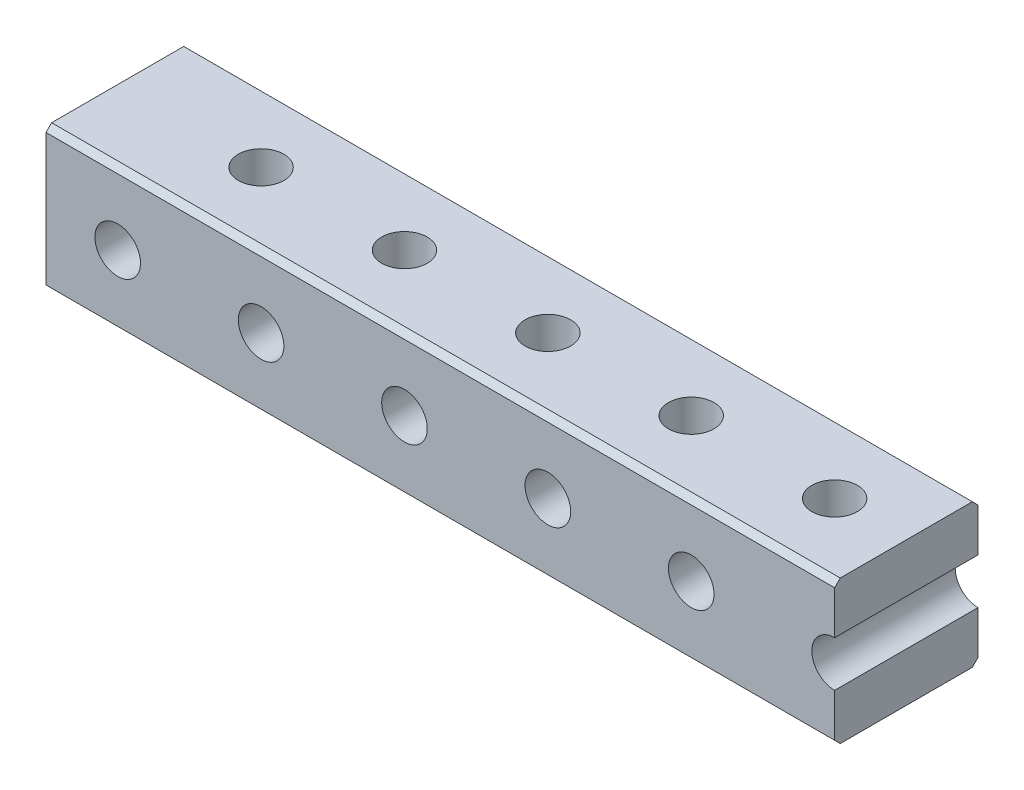
ISO-10303-21;
HEADER;
FILE_DESCRIPTION(('STEP AP214'),'2;1');
FILE_NAME('part.step','',(''),(''),'','','');
FILE_SCHEMA(('AUTOMOTIVE_DESIGN { 1 0 10303 214 1 1 1 1 }'));
ENDSEC;
DATA;
#1=APPLICATION_CONTEXT('core data for automotive mechanical design processes');
#2=APPLICATION_PROTOCOL_DEFINITION('international standard','automotive_design',2000,#1);
#3=PRODUCT_CONTEXT('',#1,'mechanical');
#4=PRODUCT('Part','Part','',(#3));
#5=PRODUCT_RELATED_PRODUCT_CATEGORY('part','',(#4));
#6=PRODUCT_DEFINITION_FORMATION('','',#4);
#7=PRODUCT_DEFINITION_CONTEXT('part definition',#1,'design');
#8=PRODUCT_DEFINITION('design','',#6,#7);
#9=PRODUCT_DEFINITION_SHAPE('','',#8);
#10=(LENGTH_UNIT() NAMED_UNIT(*) SI_UNIT(.MILLI.,.METRE.));
#11=(NAMED_UNIT(*) PLANE_ANGLE_UNIT() SI_UNIT($,.RADIAN.));
#12=(NAMED_UNIT(*) SI_UNIT($,.STERADIAN.) SOLID_ANGLE_UNIT());
#13=UNCERTAINTY_MEASURE_WITH_UNIT(LENGTH_MEASURE(1.E-05),#10,'distance_accuracy_value','');
#14=(GEOMETRIC_REPRESENTATION_CONTEXT(3) GLOBAL_UNCERTAINTY_ASSIGNED_CONTEXT((#13)) GLOBAL_UNIT_ASSIGNED_CONTEXT((#10,
#11,#12)) REPRESENTATION_CONTEXT('',''));
#15=CARTESIAN_POINT('',(0.,0.,0.));
#16=DIRECTION('',(0.,0.,1.));
#17=DIRECTION('',(1.,0.,0.));
#18=AXIS2_PLACEMENT_3D('',#15,#16,#17);
#19=CARTESIAN_POINT('',(34.925,0.,0.));
#20=DIRECTION('',(1.,0.,0.));
#21=DIRECTION('',(0.,1.,0.));
#22=AXIS2_PLACEMENT_3D('',#19,#20,#21);
#23=PLANE('',#22);
#24=DIRECTION('',(0.,0.,-1.));
#25=VECTOR('',#24,1.);
#26=CARTESIAN_POINT('',(34.925,-2.0193,6.35));
#27=LINE('',#26,#25);
#28=CARTESIAN_POINT('',(34.925,-2.0193,6.35));
#29=VERTEX_POINT('',#28);
#30=CARTESIAN_POINT('',(34.925,-2.0193,-6.35));
#31=VERTEX_POINT('',#30);
#32=EDGE_CURVE('E11',#29,#31,#27,.T.);
#33=ORIENTED_EDGE('',*,*,#32,.F.);
#34=DIRECTION('',(0.,1.,0.));
#35=VECTOR('',#34,1.);
#36=CARTESIAN_POINT('',(34.925,2.925,6.35));
#37=LINE('',#36,#35);
#38=CARTESIAN_POINT('',(34.925,-5.85,6.35));
#39=VERTEX_POINT('',#38);
#40=EDGE_CURVE('E211',#39,#29,#37,.T.);
#41=ORIENTED_EDGE('',*,*,#40,.F.);
#42=DIRECTION('',(0.,0.707106781186548,0.707106781186547));
#43=VECTOR('',#42,1.);
#44=CARTESIAN_POINT('',(34.925,-6.1,6.1));
#45=LINE('',#44,#43);
#46=CARTESIAN_POINT('',(34.925,-6.35,5.85));
#47=VERTEX_POINT('',#46);
#48=EDGE_CURVE('E207',#47,#39,#45,.T.);
#49=ORIENTED_EDGE('',*,*,#48,.F.);
#50=DIRECTION('',(0.,0.,1.));
#51=VECTOR('',#50,1.);
#52=CARTESIAN_POINT('',(34.925,-6.35,2.925));
#53=LINE('',#52,#51);
#54=CARTESIAN_POINT('',(34.925,-6.35,-5.85));
#55=VERTEX_POINT('',#54);
#56=EDGE_CURVE('E203',#55,#47,#53,.T.);
#57=ORIENTED_EDGE('',*,*,#56,.F.);
#58=DIRECTION('',(0.,-0.707106781186547,0.707106781186548));
#59=VECTOR('',#58,1.);
#60=CARTESIAN_POINT('',(34.925,-6.1,-6.1));
#61=LINE('',#60,#59);
#62=CARTESIAN_POINT('',(34.925,-5.85,-6.35));
#63=VERTEX_POINT('',#62);
#64=EDGE_CURVE('E199',#63,#55,#61,.T.);
#65=ORIENTED_EDGE('',*,*,#64,.F.);
#66=DIRECTION('',(0.,-1.,0.));
#67=VECTOR('',#66,1.);
#68=CARTESIAN_POINT('',(34.925,-2.925,-6.35));
#69=LINE('',#68,#67);
#70=EDGE_CURVE('E198',#31,#63,#69,.T.);
#71=ORIENTED_EDGE('',*,*,#70,.F.);
#72=EDGE_LOOP('',(#33,#41,#49,#57,#65,#71));
#73=FACE_BOUND('',#72,.T.);
#74=ADVANCED_FACE('F17',(#73),#23,.T.);
#75=CARTESIAN_POINT('',(117.475,6.1,-6.1));
#76=DIRECTION('',(0.,0.707106781186547,-0.707106781186548));
#77=DIRECTION('',(0.,0.707106781186548,0.707106781186547));
#78=AXIS2_PLACEMENT_3D('',#75,#76,#77);
#79=PLANE('',#78);
#80=DIRECTION('',(0.,-0.707106781186548,-0.707106781186547));
#81=VECTOR('',#80,1.);
#82=CARTESIAN_POINT('',(-34.925,6.1,-6.1));
#83=LINE('',#82,#81);
#84=CARTESIAN_POINT('',(-34.925,6.35,-5.85));
#85=VERTEX_POINT('',#84);
#86=CARTESIAN_POINT('',(-34.925,5.85,-6.35));
#87=VERTEX_POINT('',#86);
#88=EDGE_CURVE('E108',#85,#87,#83,.T.);
#89=ORIENTED_EDGE('',*,*,#88,.F.);
#90=DIRECTION('',(-1.,0.,0.));
#91=VECTOR('',#90,1.);
#92=CARTESIAN_POINT('',(117.475,6.35,-5.85));
#93=LINE('',#92,#91);
#94=CARTESIAN_POINT('',(34.925,6.35,-5.85));
#95=VERTEX_POINT('',#94);
#96=EDGE_CURVE('E93',#95,#85,#93,.T.);
#97=ORIENTED_EDGE('',*,*,#96,.F.);
#98=DIRECTION('',(0.,-0.707106781186548,-0.707106781186547));
#99=VECTOR('',#98,1.);
#100=CARTESIAN_POINT('',(34.925,6.1,-6.1));
#101=LINE('',#100,#99);
#102=CARTESIAN_POINT('',(34.925,5.85,-6.35));
#103=VERTEX_POINT('',#102);
#104=EDGE_CURVE('E146',#95,#103,#101,.T.);
#105=ORIENTED_EDGE('',*,*,#104,.T.);
#106=DIRECTION('',(-1.,0.,0.));
#107=VECTOR('',#106,1.);
#108=CARTESIAN_POINT('',(117.475,5.85,-6.35));
#109=LINE('',#108,#107);
#110=EDGE_CURVE('E110',#103,#87,#109,.T.);
#111=ORIENTED_EDGE('',*,*,#110,.T.);
#112=EDGE_LOOP('',(#89,#97,#105,#111));
#113=FACE_BOUND('',#112,.T.);
#114=ADVANCED_FACE('F109',(#113),#79,.T.);
#115=CARTESIAN_POINT('',(117.475,6.35,-2.925));
#116=DIRECTION('',(0.,1.,0.));
#117=DIRECTION('',(0.,0.,1.));
#118=AXIS2_PLACEMENT_3D('',#115,#116,#117);
#119=PLANE('',#118);
#120=CARTESIAN_POINT('',(-22.225,6.35,0.));
#121=DIRECTION('',(0.,1.,0.));
#122=DIRECTION('',(0.,0.,1.));
#123=AXIS2_PLACEMENT_3D('',#120,#121,#122);
#124=CIRCLE('',#123,2.0193);
#125=CARTESIAN_POINT('',(-22.225,6.35,2.0193));
#126=VERTEX_POINT('',#125);
#127=EDGE_CURVE('E115',#126,#126,#124,.F.);
#128=ORIENTED_EDGE('',*,*,#127,.T.);
#129=EDGE_LOOP('',(#128));
#130=FACE_BOUND('',#129,.T.);
#131=CARTESIAN_POINT('',(-9.525,6.35,0.));
#132=DIRECTION('',(0.,1.,0.));
#133=DIRECTION('',(0.,0.,1.));
#134=AXIS2_PLACEMENT_3D('',#131,#132,#133);
#135=CIRCLE('',#134,2.0193);
#136=CARTESIAN_POINT('',(-9.525,6.35,2.0193));
#137=VERTEX_POINT('',#136);
#138=EDGE_CURVE('E242',#137,#137,#135,.F.);
#139=ORIENTED_EDGE('',*,*,#138,.T.);
#140=EDGE_LOOP('',(#139));
#141=FACE_BOUND('',#140,.T.);
#142=CARTESIAN_POINT('',(3.175,6.35,0.));
#143=DIRECTION('',(0.,1.,0.));
#144=DIRECTION('',(0.,0.,1.));
#145=AXIS2_PLACEMENT_3D('',#142,#143,#144);
#146=CIRCLE('',#145,2.0193);
#147=CARTESIAN_POINT('',(3.175,6.35,2.0193));
#148=VERTEX_POINT('',#147);
#149=EDGE_CURVE('E285',#148,#148,#146,.F.);
#150=ORIENTED_EDGE('',*,*,#149,.T.);
#151=EDGE_LOOP('',(#150));
#152=FACE_BOUND('',#151,.T.);
#153=CARTESIAN_POINT('',(15.875,6.35,0.));
#154=DIRECTION('',(0.,1.,0.));
#155=DIRECTION('',(0.,0.,1.));
#156=AXIS2_PLACEMENT_3D('',#153,#154,#155);
#157=CIRCLE('',#156,2.0193);
#158=CARTESIAN_POINT('',(15.875,6.35,2.0193));
#159=VERTEX_POINT('',#158);
#160=EDGE_CURVE('E281',#159,#159,#157,.F.);
#161=ORIENTED_EDGE('',*,*,#160,.T.);
#162=EDGE_LOOP('',(#161));
#163=FACE_BOUND('',#162,.T.);
#164=CARTESIAN_POINT('',(28.575,6.35,0.));
#165=DIRECTION('',(0.,1.,0.));
#166=DIRECTION('',(0.,0.,1.));
#167=AXIS2_PLACEMENT_3D('',#164,#165,#166);
#168=CIRCLE('',#167,2.0193);
#169=CARTESIAN_POINT('',(28.575,6.35,2.0193));
#170=VERTEX_POINT('',#169);
#171=EDGE_CURVE('E266',#170,#170,#168,.F.);
#172=ORIENTED_EDGE('',*,*,#171,.T.);
#173=EDGE_LOOP('',(#172));
#174=FACE_BOUND('',#173,.T.);
#175=DIRECTION('',(0.,0.,-1.));
#176=VECTOR('',#175,1.);
#177=CARTESIAN_POINT('',(-34.925,6.35,-2.925));
#178=LINE('',#177,#176);
#179=CARTESIAN_POINT('',(-34.925,6.35,5.85));
#180=VERTEX_POINT('',#179);
#181=EDGE_CURVE('E97',#180,#85,#178,.T.);
#182=ORIENTED_EDGE('',*,*,#181,.F.);
#183=DIRECTION('',(-1.,0.,0.));
#184=VECTOR('',#183,1.);
#185=CARTESIAN_POINT('',(117.475,6.35,5.85));
#186=LINE('',#185,#184);
#187=CARTESIAN_POINT('',(34.925,6.35,5.85));
#188=VERTEX_POINT('',#187);
#189=EDGE_CURVE('E105',#188,#180,#186,.T.);
#190=ORIENTED_EDGE('',*,*,#189,.F.);
#191=DIRECTION('',(0.,0.,-1.));
#192=VECTOR('',#191,1.);
#193=CARTESIAN_POINT('',(34.925,6.35,-2.925));
#194=LINE('',#193,#192);
#195=EDGE_CURVE('E100',#188,#95,#194,.T.);
#196=ORIENTED_EDGE('',*,*,#195,.T.);
#197=ORIENTED_EDGE('',*,*,#96,.T.);
#198=EDGE_LOOP('',(#182,#190,#196,#197));
#199=FACE_BOUND('',#198,.T.);
#200=ADVANCED_FACE('F95',(#130,#141,#152,#163,#174,#199),#119,.T.);
#201=CARTESIAN_POINT('',(117.475,6.1,6.1));
#202=DIRECTION('',(0.,0.707106781186548,0.707106781186547));
#203=DIRECTION('',(0.,-0.707106781186547,0.707106781186548));
#204=AXIS2_PLACEMENT_3D('',#201,#202,#203);
#205=PLANE('',#204);
#206=DIRECTION('',(0.,0.707106781186547,-0.707106781186548));
#207=VECTOR('',#206,1.);
#208=CARTESIAN_POINT('',(-34.925,6.1,6.1));
#209=LINE('',#208,#207);
#210=CARTESIAN_POINT('',(-34.925,5.85,6.35));
#211=VERTEX_POINT('',#210);
#212=EDGE_CURVE('E120',#211,#180,#209,.T.);
#213=ORIENTED_EDGE('',*,*,#212,.F.);
#214=DIRECTION('',(-1.,0.,0.));
#215=VECTOR('',#214,1.);
#216=CARTESIAN_POINT('',(117.475,5.85,6.35));
#217=LINE('',#216,#215);
#218=CARTESIAN_POINT('',(34.925,5.85,6.35));
#219=VERTEX_POINT('',#218);
#220=EDGE_CURVE('E162',#219,#211,#217,.T.);
#221=ORIENTED_EDGE('',*,*,#220,.F.);
#222=DIRECTION('',(0.,0.707106781186547,-0.707106781186548));
#223=VECTOR('',#222,1.);
#224=CARTESIAN_POINT('',(34.925,6.1,6.1));
#225=LINE('',#224,#223);
#226=EDGE_CURVE('E216',#219,#188,#225,.T.);
#227=ORIENTED_EDGE('',*,*,#226,.T.);
#228=ORIENTED_EDGE('',*,*,#189,.T.);
#229=EDGE_LOOP('',(#213,#221,#227,#228));
#230=FACE_BOUND('',#229,.T.);
#231=ADVANCED_FACE('F231',(#230),#205,.T.);
#232=CARTESIAN_POINT('',(117.475,2.925,6.35));
#233=DIRECTION('',(0.,0.,1.));
#234=DIRECTION('',(1.,0.,0.));
#235=AXIS2_PLACEMENT_3D('',#232,#233,#234);
#236=PLANE('',#235);
#237=CARTESIAN_POINT('',(-28.575,0.,6.35));
#238=DIRECTION('',(0.,0.,-1.));
#239=DIRECTION('',(-1.,0.,0.));
#240=AXIS2_PLACEMENT_3D('',#237,#238,#239);
#241=CIRCLE('',#240,2.0193);
#242=CARTESIAN_POINT('',(-30.5943,0.,6.35));
#243=VERTEX_POINT('',#242);
#244=EDGE_CURVE('E172',#243,#243,#241,.T.);
#245=ORIENTED_EDGE('',*,*,#244,.T.);
#246=EDGE_LOOP('',(#245));
#247=FACE_BOUND('',#246,.T.);
#248=CARTESIAN_POINT('',(-15.875,0.,6.35));
#249=DIRECTION('',(0.,0.,-1.));
#250=DIRECTION('',(-1.,0.,0.));
#251=AXIS2_PLACEMENT_3D('',#248,#249,#250);
#252=CIRCLE('',#251,2.0193);
#253=CARTESIAN_POINT('',(-17.8943,0.,6.35));
#254=VERTEX_POINT('',#253);
#255=EDGE_CURVE('E388',#254,#254,#252,.T.);
#256=ORIENTED_EDGE('',*,*,#255,.T.);
#257=EDGE_LOOP('',(#256));
#258=FACE_BOUND('',#257,.T.);
#259=CARTESIAN_POINT('',(-3.175,0.,6.35));
#260=DIRECTION('',(0.,0.,-1.));
#261=DIRECTION('',(-1.,0.,0.));
#262=AXIS2_PLACEMENT_3D('',#259,#260,#261);
#263=CIRCLE('',#262,2.0193);
#264=CARTESIAN_POINT('',(-5.1943,0.,6.35));
#265=VERTEX_POINT('',#264);
#266=EDGE_CURVE('E256',#265,#265,#263,.T.);
#267=ORIENTED_EDGE('',*,*,#266,.T.);
#268=EDGE_LOOP('',(#267));
#269=FACE_BOUND('',#268,.T.);
#270=CARTESIAN_POINT('',(9.525,0.,6.35));
#271=DIRECTION('',(0.,0.,-1.));
#272=DIRECTION('',(-1.,0.,0.));
#273=AXIS2_PLACEMENT_3D('',#270,#271,#272);
#274=CIRCLE('',#273,2.0193);
#275=CARTESIAN_POINT('',(7.5057,0.,6.35));
#276=VERTEX_POINT('',#275);
#277=EDGE_CURVE('E250',#276,#276,#274,.T.);
#278=ORIENTED_EDGE('',*,*,#277,.T.);
#279=EDGE_LOOP('',(#278));
#280=FACE_BOUND('',#279,.T.);
#281=CARTESIAN_POINT('',(22.225,0.,6.35));
#282=DIRECTION('',(0.,0.,-1.));
#283=DIRECTION('',(-1.,0.,0.));
#284=AXIS2_PLACEMENT_3D('',#281,#282,#283);
#285=CIRCLE('',#284,2.0193);
#286=CARTESIAN_POINT('',(20.2057,0.,6.35));
#287=VERTEX_POINT('',#286);
#288=EDGE_CURVE('E248',#287,#287,#285,.T.);
#289=ORIENTED_EDGE('',*,*,#288,.T.);
#290=EDGE_LOOP('',(#289));
#291=FACE_BOUND('',#290,.T.);
#292=DIRECTION('',(0.,1.,0.));
#293=VECTOR('',#292,1.);
#294=CARTESIAN_POINT('',(-34.925,2.925,6.35));
#295=LINE('',#294,#293);
#296=CARTESIAN_POINT('',(-34.925,-5.85,6.35));
#297=VERTEX_POINT('',#296);
#298=EDGE_CURVE('E126',#297,#211,#295,.T.);
#299=ORIENTED_EDGE('',*,*,#298,.F.);
#300=DIRECTION('',(-1.,0.,0.));
#301=VECTOR('',#300,1.);
#302=CARTESIAN_POINT('',(117.475,-5.85,6.35));
#303=LINE('',#302,#301);
#304=EDGE_CURVE('E159',#39,#297,#303,.T.);
#305=ORIENTED_EDGE('',*,*,#304,.F.);
#306=ORIENTED_EDGE('',*,*,#40,.T.);
#307=CARTESIAN_POINT('',(34.925,0.,6.35));
#308=DIRECTION('',(0.,0.,-1.));
#309=DIRECTION('',(-1.,0.,0.));
#310=AXIS2_PLACEMENT_3D('',#307,#308,#309);
#311=CIRCLE('',#310,2.0193);
#312=CARTESIAN_POINT('',(34.925,2.0193,6.35));
#313=VERTEX_POINT('',#312);
#314=EDGE_CURVE('E235',#29,#313,#311,.T.);
#315=ORIENTED_EDGE('',*,*,#314,.T.);
#316=EDGE_CURVE('E215',#313,#219,#37,.T.);
#317=ORIENTED_EDGE('',*,*,#316,.T.);
#318=ORIENTED_EDGE('',*,*,#220,.T.);
#319=EDGE_LOOP('',(#299,#305,#306,#315,#317,#318));
#320=FACE_BOUND('',#319,.T.);
#321=ADVANCED_FACE('F234',(#247,#258,#269,#280,#291,#320),#236,.T.);
#322=CARTESIAN_POINT('',(117.475,-6.1,6.1));
#323=DIRECTION('',(0.,-0.707106781186547,0.707106781186548));
#324=DIRECTION('',(0.,-0.707106781186548,-0.707106781186547));
#325=AXIS2_PLACEMENT_3D('',#322,#323,#324);
#326=PLANE('',#325);
#327=DIRECTION('',(0.,0.707106781186548,0.707106781186547));
#328=VECTOR('',#327,1.);
#329=CARTESIAN_POINT('',(-34.925,-6.1,6.1));
#330=LINE('',#329,#328);
#331=CARTESIAN_POINT('',(-34.925,-6.35,5.85));
#332=VERTEX_POINT('',#331);
#333=EDGE_CURVE('E131',#332,#297,#330,.T.);
#334=ORIENTED_EDGE('',*,*,#333,.F.);
#335=DIRECTION('',(-1.,0.,0.));
#336=VECTOR('',#335,1.);
#337=CARTESIAN_POINT('',(117.475,-6.35,5.85));
#338=LINE('',#337,#336);
#339=EDGE_CURVE('E156',#47,#332,#338,.T.);
#340=ORIENTED_EDGE('',*,*,#339,.F.);
#341=ORIENTED_EDGE('',*,*,#48,.T.);
#342=ORIENTED_EDGE('',*,*,#304,.T.);
#343=EDGE_LOOP('',(#334,#340,#341,#342));
#344=FACE_BOUND('',#343,.T.);
#345=ADVANCED_FACE('F307',(#344),#326,.T.);
#346=CARTESIAN_POINT('',(117.475,-6.35,2.925));
#347=DIRECTION('',(0.,-1.,0.));
#348=DIRECTION('',(0.,0.,-1.));
#349=AXIS2_PLACEMENT_3D('',#346,#347,#348);
#350=PLANE('',#349);
#351=CARTESIAN_POINT('',(-22.225,-6.35,0.));
#352=DIRECTION('',(0.,1.,0.));
#353=DIRECTION('',(0.,0.,1.));
#354=AXIS2_PLACEMENT_3D('',#351,#352,#353);
#355=CIRCLE('',#354,2.0193);
#356=CARTESIAN_POINT('',(-22.225,-6.35,2.0193));
#357=VERTEX_POINT('',#356);
#358=EDGE_CURVE('E262',#357,#357,#355,.T.);
#359=ORIENTED_EDGE('',*,*,#358,.T.);
#360=EDGE_LOOP('',(#359));
#361=FACE_BOUND('',#360,.T.);
#362=CARTESIAN_POINT('',(-9.525,-6.35,0.));
#363=DIRECTION('',(0.,1.,0.));
#364=DIRECTION('',(0.,0.,1.));
#365=AXIS2_PLACEMENT_3D('',#362,#363,#364);
#366=CIRCLE('',#365,2.0193);
#367=CARTESIAN_POINT('',(-9.525,-6.35,2.0193));
#368=VERTEX_POINT('',#367);
#369=EDGE_CURVE('E267',#368,#368,#366,.T.);
#370=ORIENTED_EDGE('',*,*,#369,.T.);
#371=EDGE_LOOP('',(#370));
#372=FACE_BOUND('',#371,.T.);
#373=CARTESIAN_POINT('',(3.175,-6.35,0.));
#374=DIRECTION('',(0.,1.,0.));
#375=DIRECTION('',(0.,0.,1.));
#376=AXIS2_PLACEMENT_3D('',#373,#374,#375);
#377=CIRCLE('',#376,2.0193);
#378=CARTESIAN_POINT('',(3.175,-6.35,2.0193));
#379=VERTEX_POINT('',#378);
#380=EDGE_CURVE('E271',#379,#379,#377,.T.);
#381=ORIENTED_EDGE('',*,*,#380,.T.);
#382=EDGE_LOOP('',(#381));
#383=FACE_BOUND('',#382,.T.);
#384=CARTESIAN_POINT('',(15.875,-6.35,0.));
#385=DIRECTION('',(0.,1.,0.));
#386=DIRECTION('',(0.,0.,1.));
#387=AXIS2_PLACEMENT_3D('',#384,#385,#386);
#388=CIRCLE('',#387,2.0193);
#389=CARTESIAN_POINT('',(15.875,-6.35,2.0193));
#390=VERTEX_POINT('',#389);
#391=EDGE_CURVE('E245',#390,#390,#388,.T.);
#392=ORIENTED_EDGE('',*,*,#391,.T.);
#393=EDGE_LOOP('',(#392));
#394=FACE_BOUND('',#393,.T.);
#395=CARTESIAN_POINT('',(28.575,-6.35,0.));
#396=DIRECTION('',(0.,1.,0.));
#397=DIRECTION('',(0.,0.,1.));
#398=AXIS2_PLACEMENT_3D('',#395,#396,#397);
#399=CIRCLE('',#398,2.0193);
#400=CARTESIAN_POINT('',(28.575,-6.35,2.0193));
#401=VERTEX_POINT('',#400);
#402=EDGE_CURVE('E192',#401,#401,#399,.T.);
#403=ORIENTED_EDGE('',*,*,#402,.T.);
#404=EDGE_LOOP('',(#403));
#405=FACE_BOUND('',#404,.T.);
#406=DIRECTION('',(0.,0.,1.));
#407=VECTOR('',#406,1.);
#408=CARTESIAN_POINT('',(-34.925,-6.35,2.925));
#409=LINE('',#408,#407);
#410=CARTESIAN_POINT('',(-34.925,-6.35,-5.85));
#411=VERTEX_POINT('',#410);
#412=EDGE_CURVE('E135',#411,#332,#409,.T.);
#413=ORIENTED_EDGE('',*,*,#412,.F.);
#414=DIRECTION('',(-1.,0.,0.));
#415=VECTOR('',#414,1.);
#416=CARTESIAN_POINT('',(117.475,-6.35,-5.85));
#417=LINE('',#416,#415);
#418=EDGE_CURVE('E153',#55,#411,#417,.T.);
#419=ORIENTED_EDGE('',*,*,#418,.F.);
#420=ORIENTED_EDGE('',*,*,#56,.T.);
#421=ORIENTED_EDGE('',*,*,#339,.T.);
#422=EDGE_LOOP('',(#413,#419,#420,#421));
#423=FACE_BOUND('',#422,.T.);
#424=ADVANCED_FACE('F303',(#361,#372,#383,#394,#405,#423),#350,.T.);
#425=CARTESIAN_POINT('',(117.475,-6.1,-6.1));
#426=DIRECTION('',(0.,-0.707106781186548,-0.707106781186547));
#427=DIRECTION('',(0.,0.707106781186547,-0.707106781186548));
#428=AXIS2_PLACEMENT_3D('',#425,#426,#427);
#429=PLANE('',#428);
#430=DIRECTION('',(0.,-0.707106781186547,0.707106781186548));
#431=VECTOR('',#430,1.);
#432=CARTESIAN_POINT('',(-34.925,-6.1,-6.1));
#433=LINE('',#432,#431);
#434=CARTESIAN_POINT('',(-34.925,-5.85,-6.35));
#435=VERTEX_POINT('',#434);
#436=EDGE_CURVE('E139',#435,#411,#433,.T.);
#437=ORIENTED_EDGE('',*,*,#436,.F.);
#438=DIRECTION('',(-1.,0.,0.));
#439=VECTOR('',#438,1.);
#440=CARTESIAN_POINT('',(117.475,-5.85,-6.35));
#441=LINE('',#440,#439);
#442=EDGE_CURVE('E149',#63,#435,#441,.T.);
#443=ORIENTED_EDGE('',*,*,#442,.F.);
#444=ORIENTED_EDGE('',*,*,#64,.T.);
#445=ORIENTED_EDGE('',*,*,#418,.T.);
#446=EDGE_LOOP('',(#437,#443,#444,#445));
#447=FACE_BOUND('',#446,.T.);
#448=ADVANCED_FACE('F306',(#447),#429,.T.);
#449=CARTESIAN_POINT('',(117.475,-2.925,-6.35));
#450=DIRECTION('',(0.,0.,-1.));
#451=DIRECTION('',(-1.,0.,0.));
#452=AXIS2_PLACEMENT_3D('',#449,#450,#451);
#453=PLANE('',#452);
#454=CARTESIAN_POINT('',(-28.575,0.,-6.35));
#455=DIRECTION('',(0.,0.,-1.));
#456=DIRECTION('',(-1.,0.,0.));
#457=AXIS2_PLACEMENT_3D('',#454,#455,#456);
#458=CIRCLE('',#457,2.0193);
#459=CARTESIAN_POINT('',(-30.5943,0.,-6.35));
#460=VERTEX_POINT('',#459);
#461=EDGE_CURVE('E188',#460,#460,#458,.F.);
#462=ORIENTED_EDGE('',*,*,#461,.T.);
#463=EDGE_LOOP('',(#462));
#464=FACE_BOUND('',#463,.T.);
#465=CARTESIAN_POINT('',(-15.875,0.,-6.35));
#466=DIRECTION('',(0.,0.,-1.));
#467=DIRECTION('',(-1.,0.,0.));
#468=AXIS2_PLACEMENT_3D('',#465,#466,#467);
#469=CIRCLE('',#468,2.0193);
#470=CARTESIAN_POINT('',(-17.8943,0.,-6.35));
#471=VERTEX_POINT('',#470);
#472=EDGE_CURVE('E184',#471,#471,#469,.F.);
#473=ORIENTED_EDGE('',*,*,#472,.T.);
#474=EDGE_LOOP('',(#473));
#475=FACE_BOUND('',#474,.T.);
#476=CARTESIAN_POINT('',(-3.175,0.,-6.35));
#477=DIRECTION('',(0.,0.,-1.));
#478=DIRECTION('',(-1.,0.,0.));
#479=AXIS2_PLACEMENT_3D('',#476,#477,#478);
#480=CIRCLE('',#479,2.0193);
#481=CARTESIAN_POINT('',(-5.1943,0.,-6.35));
#482=VERTEX_POINT('',#481);
#483=EDGE_CURVE('E180',#482,#482,#480,.F.);
#484=ORIENTED_EDGE('',*,*,#483,.T.);
#485=EDGE_LOOP('',(#484));
#486=FACE_BOUND('',#485,.T.);
#487=CARTESIAN_POINT('',(9.525,0.,-6.35));
#488=DIRECTION('',(0.,0.,-1.));
#489=DIRECTION('',(-1.,0.,0.));
#490=AXIS2_PLACEMENT_3D('',#487,#488,#489);
#491=CIRCLE('',#490,2.0193);
#492=CARTESIAN_POINT('',(7.5057,0.,-6.35));
#493=VERTEX_POINT('',#492);
#494=EDGE_CURVE('E176',#493,#493,#491,.F.);
#495=ORIENTED_EDGE('',*,*,#494,.T.);
#496=EDGE_LOOP('',(#495));
#497=FACE_BOUND('',#496,.T.);
#498=CARTESIAN_POINT('',(22.225,0.,-6.35));
#499=DIRECTION('',(0.,0.,-1.));
#500=DIRECTION('',(-1.,0.,0.));
#501=AXIS2_PLACEMENT_3D('',#498,#499,#500);
#502=CIRCLE('',#501,2.0193);
#503=CARTESIAN_POINT('',(20.2057,0.,-6.35));
#504=VERTEX_POINT('',#503);
#505=EDGE_CURVE('E171',#504,#504,#502,.F.);
#506=ORIENTED_EDGE('',*,*,#505,.T.);
#507=EDGE_LOOP('',(#506));
#508=FACE_BOUND('',#507,.T.);
#509=DIRECTION('',(0.,-1.,0.));
#510=VECTOR('',#509,1.);
#511=CARTESIAN_POINT('',(-34.925,-2.925,-6.35));
#512=LINE('',#511,#510);
#513=EDGE_CURVE('E143',#87,#435,#512,.T.);
#514=ORIENTED_EDGE('',*,*,#513,.F.);
#515=ORIENTED_EDGE('',*,*,#110,.F.);
#516=CARTESIAN_POINT('',(34.925,2.0193,-6.35));
#517=VERTEX_POINT('',#516);
#518=EDGE_CURVE('E150',#103,#517,#69,.T.);
#519=ORIENTED_EDGE('',*,*,#518,.T.);
#520=CARTESIAN_POINT('',(34.925,0.,-6.35));
#521=DIRECTION('',(0.,0.,-1.));
#522=DIRECTION('',(-1.,0.,0.));
#523=AXIS2_PLACEMENT_3D('',#520,#521,#522);
#524=CIRCLE('',#523,2.0193);
#525=EDGE_CURVE('E167',#517,#31,#524,.F.);
#526=ORIENTED_EDGE('',*,*,#525,.T.);
#527=ORIENTED_EDGE('',*,*,#70,.T.);
#528=ORIENTED_EDGE('',*,*,#442,.T.);
#529=EDGE_LOOP('',(#514,#515,#519,#526,#527,#528));
#530=FACE_BOUND('',#529,.T.);
#531=ADVANCED_FACE('F228',(#464,#475,#486,#497,#508,#530),#453,.T.);
#532=ORIENTED_EDGE('',*,*,#316,.F.);
#533=DIRECTION('',(0.,0.,-1.));
#534=VECTOR('',#533,1.);
#535=CARTESIAN_POINT('',(34.925,2.0193,6.35));
#536=LINE('',#535,#534);
#537=EDGE_CURVE('E26',#313,#517,#536,.T.);
#538=ORIENTED_EDGE('',*,*,#537,.T.);
#539=ORIENTED_EDGE('',*,*,#518,.F.);
#540=ORIENTED_EDGE('',*,*,#104,.F.);
#541=ORIENTED_EDGE('',*,*,#195,.F.);
#542=ORIENTED_EDGE('',*,*,#226,.F.);
#543=EDGE_LOOP('',(#532,#538,#539,#540,#541,#542));
#544=FACE_BOUND('',#543,.T.);
#545=ADVANCED_FACE('F19',(#544),#23,.T.);
#546=CARTESIAN_POINT('',(-34.925,0.,0.));
#547=DIRECTION('',(1.,0.,0.));
#548=DIRECTION('',(0.,1.,0.));
#549=AXIS2_PLACEMENT_3D('',#546,#547,#548);
#550=PLANE('',#549);
#551=ORIENTED_EDGE('',*,*,#88,.T.);
#552=ORIENTED_EDGE('',*,*,#513,.T.);
#553=ORIENTED_EDGE('',*,*,#436,.T.);
#554=ORIENTED_EDGE('',*,*,#412,.T.);
#555=ORIENTED_EDGE('',*,*,#333,.T.);
#556=ORIENTED_EDGE('',*,*,#298,.T.);
#557=ORIENTED_EDGE('',*,*,#212,.T.);
#558=ORIENTED_EDGE('',*,*,#181,.T.);
#559=EDGE_LOOP('',(#551,#552,#553,#554,#555,#556,#557,#558));
#560=FACE_BOUND('',#559,.T.);
#561=ADVANCED_FACE('F117',(#560),#550,.F.);
#562=CARTESIAN_POINT('',(28.575,-6.35,0.));
#563=DIRECTION('',(0.,1.,0.));
#564=DIRECTION('',(0.,0.,1.));
#565=AXIS2_PLACEMENT_3D('',#562,#563,#564);
#566=CYLINDRICAL_SURFACE('',#565,2.0193);
#567=ORIENTED_EDGE('',*,*,#171,.F.);
#568=EDGE_LOOP('',(#567));
#569=FACE_BOUND('',#568,.T.);
#570=ORIENTED_EDGE('',*,*,#402,.F.);
#571=EDGE_LOOP('',(#570));
#572=FACE_BOUND('',#571,.T.);
#573=ADVANCED_FACE('F339',(#569,#572),#566,.F.);
#574=CARTESIAN_POINT('',(15.875,-6.35,0.));
#575=DIRECTION('',(0.,1.,0.));
#576=DIRECTION('',(0.,0.,1.));
#577=AXIS2_PLACEMENT_3D('',#574,#575,#576);
#578=CYLINDRICAL_SURFACE('',#577,2.0193);
#579=ORIENTED_EDGE('',*,*,#160,.F.);
#580=EDGE_LOOP('',(#579));
#581=FACE_BOUND('',#580,.T.);
#582=ORIENTED_EDGE('',*,*,#391,.F.);
#583=EDGE_LOOP('',(#582));
#584=FACE_BOUND('',#583,.T.);
#585=ADVANCED_FACE('F350',(#581,#584),#578,.F.);
#586=CARTESIAN_POINT('',(3.175,-6.35,0.));
#587=DIRECTION('',(0.,1.,0.));
#588=DIRECTION('',(0.,0.,1.));
#589=AXIS2_PLACEMENT_3D('',#586,#587,#588);
#590=CYLINDRICAL_SURFACE('',#589,2.0193);
#591=ORIENTED_EDGE('',*,*,#149,.F.);
#592=EDGE_LOOP('',(#591));
#593=FACE_BOUND('',#592,.T.);
#594=ORIENTED_EDGE('',*,*,#380,.F.);
#595=EDGE_LOOP('',(#594));
#596=FACE_BOUND('',#595,.T.);
#597=ADVANCED_FACE('F299',(#593,#596),#590,.F.);
#598=CARTESIAN_POINT('',(-9.525,-6.35,0.));
#599=DIRECTION('',(0.,1.,0.));
#600=DIRECTION('',(0.,0.,1.));
#601=AXIS2_PLACEMENT_3D('',#598,#599,#600);
#602=CYLINDRICAL_SURFACE('',#601,2.0193);
#603=ORIENTED_EDGE('',*,*,#138,.F.);
#604=EDGE_LOOP('',(#603));
#605=FACE_BOUND('',#604,.T.);
#606=ORIENTED_EDGE('',*,*,#369,.F.);
#607=EDGE_LOOP('',(#606));
#608=FACE_BOUND('',#607,.T.);
#609=ADVANCED_FACE('F295',(#605,#608),#602,.F.);
#610=CARTESIAN_POINT('',(-22.225,-6.35,0.));
#611=DIRECTION('',(0.,1.,0.));
#612=DIRECTION('',(0.,0.,1.));
#613=AXIS2_PLACEMENT_3D('',#610,#611,#612);
#614=CYLINDRICAL_SURFACE('',#613,2.0193);
#615=ORIENTED_EDGE('',*,*,#127,.F.);
#616=EDGE_LOOP('',(#615));
#617=FACE_BOUND('',#616,.T.);
#618=ORIENTED_EDGE('',*,*,#358,.F.);
#619=EDGE_LOOP('',(#618));
#620=FACE_BOUND('',#619,.T.);
#621=ADVANCED_FACE('F298',(#617,#620),#614,.F.);
#622=CARTESIAN_POINT('',(34.925,0.,6.35));
#623=DIRECTION('',(0.,0.,-1.));
#624=DIRECTION('',(-1.,0.,0.));
#625=AXIS2_PLACEMENT_3D('',#622,#623,#624);
#626=CYLINDRICAL_SURFACE('',#625,2.0193);
#627=ORIENTED_EDGE('',*,*,#314,.F.);
#628=ORIENTED_EDGE('',*,*,#32,.T.);
#629=ORIENTED_EDGE('',*,*,#525,.F.);
#630=ORIENTED_EDGE('',*,*,#537,.F.);
#631=EDGE_LOOP('',(#627,#628,#629,#630));
#632=FACE_BOUND('',#631,.T.);
#633=ADVANCED_FACE('F226',(#632),#626,.F.);
#634=CARTESIAN_POINT('',(22.225,0.,6.35));
#635=DIRECTION('',(0.,0.,-1.));
#636=DIRECTION('',(-1.,0.,0.));
#637=AXIS2_PLACEMENT_3D('',#634,#635,#636);
#638=CYLINDRICAL_SURFACE('',#637,2.0193);
#639=ORIENTED_EDGE('',*,*,#505,.F.);
#640=EDGE_LOOP('',(#639));
#641=FACE_BOUND('',#640,.T.);
#642=ORIENTED_EDGE('',*,*,#288,.F.);
#643=EDGE_LOOP('',(#642));
#644=FACE_BOUND('',#643,.T.);
#645=ADVANCED_FACE('F363',(#641,#644),#638,.F.);
#646=CARTESIAN_POINT('',(9.525,0.,6.35));
#647=DIRECTION('',(0.,0.,-1.));
#648=DIRECTION('',(-1.,0.,0.));
#649=AXIS2_PLACEMENT_3D('',#646,#647,#648);
#650=CYLINDRICAL_SURFACE('',#649,2.0193);
#651=ORIENTED_EDGE('',*,*,#494,.F.);
#652=EDGE_LOOP('',(#651));
#653=FACE_BOUND('',#652,.T.);
#654=ORIENTED_EDGE('',*,*,#277,.F.);
#655=EDGE_LOOP('',(#654));
#656=FACE_BOUND('',#655,.T.);
#657=ADVANCED_FACE('F366',(#653,#656),#650,.F.);
#658=CARTESIAN_POINT('',(-3.175,0.,6.35));
#659=DIRECTION('',(0.,0.,-1.));
#660=DIRECTION('',(-1.,0.,0.));
#661=AXIS2_PLACEMENT_3D('',#658,#659,#660);
#662=CYLINDRICAL_SURFACE('',#661,2.0193);
#663=ORIENTED_EDGE('',*,*,#483,.F.);
#664=EDGE_LOOP('',(#663));
#665=FACE_BOUND('',#664,.T.);
#666=ORIENTED_EDGE('',*,*,#266,.F.);
#667=EDGE_LOOP('',(#666));
#668=FACE_BOUND('',#667,.T.);
#669=ADVANCED_FACE('F370',(#665,#668),#662,.F.);
#670=CARTESIAN_POINT('',(-15.875,0.,6.35));
#671=DIRECTION('',(0.,0.,-1.));
#672=DIRECTION('',(-1.,0.,0.));
#673=AXIS2_PLACEMENT_3D('',#670,#671,#672);
#674=CYLINDRICAL_SURFACE('',#673,2.0193);
#675=ORIENTED_EDGE('',*,*,#472,.F.);
#676=EDGE_LOOP('',(#675));
#677=FACE_BOUND('',#676,.T.);
#678=ORIENTED_EDGE('',*,*,#255,.F.);
#679=EDGE_LOOP('',(#678));
#680=FACE_BOUND('',#679,.T.);
#681=ADVANCED_FACE('F374',(#677,#680),#674,.F.);
#682=CARTESIAN_POINT('',(-28.575,0.,6.35));
#683=DIRECTION('',(0.,0.,-1.));
#684=DIRECTION('',(-1.,0.,0.));
#685=AXIS2_PLACEMENT_3D('',#682,#683,#684);
#686=CYLINDRICAL_SURFACE('',#685,2.0193);
#687=ORIENTED_EDGE('',*,*,#461,.F.);
#688=EDGE_LOOP('',(#687));
#689=FACE_BOUND('',#688,.T.);
#690=ORIENTED_EDGE('',*,*,#244,.F.);
#691=EDGE_LOOP('',(#690));
#692=FACE_BOUND('',#691,.T.);
#693=ADVANCED_FACE('F378',(#689,#692),#686,.F.);
#694=CLOSED_SHELL('',(#74,#114,#200,#231,#321,#345,#424,#448,#531,#545,#561,#573,#585,#597,#609,
#621,#633,#645,#657,#669,#681,#693));
#695=MANIFOLD_SOLID_BREP('B1',#694);
#696=ADVANCED_BREP_SHAPE_REPRESENTATION('',(#18,#695),#14);
#697=SHAPE_DEFINITION_REPRESENTATION(#9,#696);
ENDSEC;
END-ISO-10303-21;
